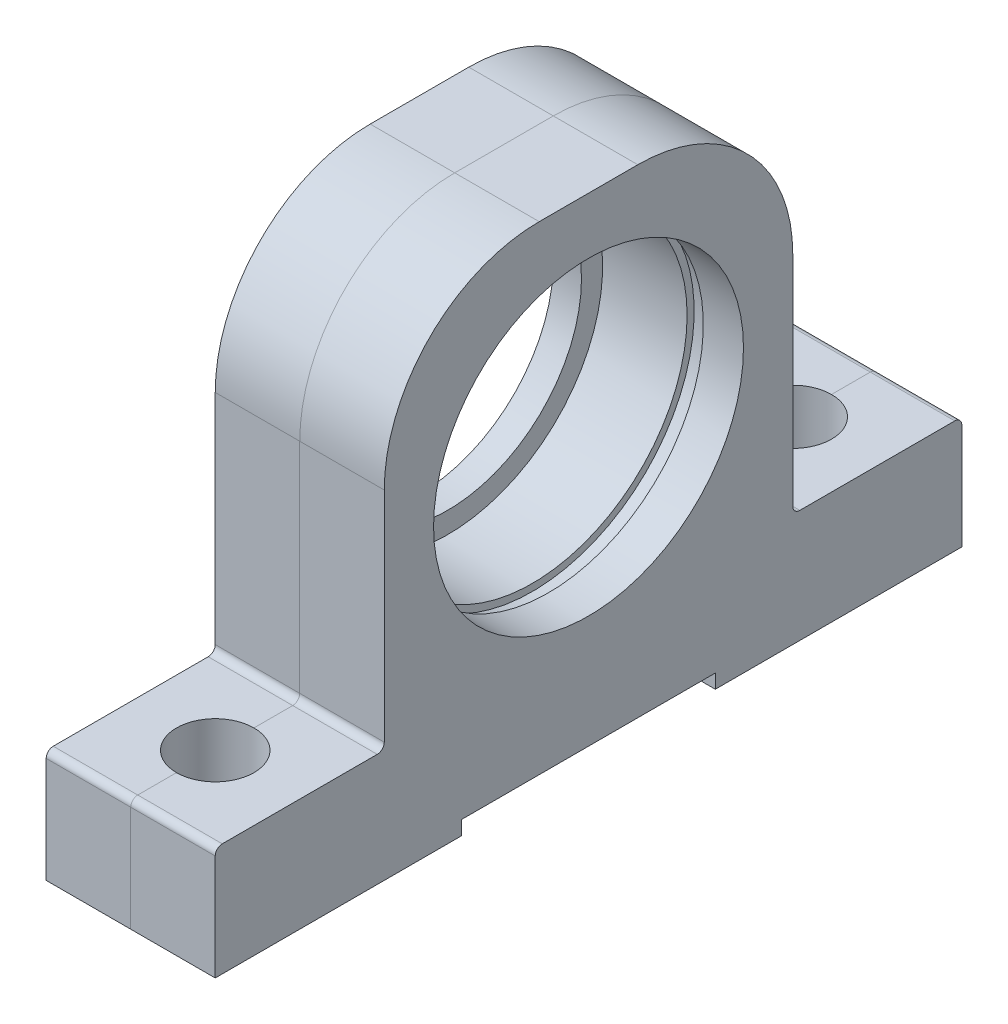
ISO-10303-21;
HEADER;
FILE_DESCRIPTION(('STEP AP214'),'2;1');
FILE_NAME('part.step','',(''),(''),'','','');
FILE_SCHEMA(('AUTOMOTIVE_DESIGN { 1 0 10303 214 1 1 1 1 }'));
ENDSEC;
DATA;
#1=APPLICATION_CONTEXT('core data for automotive mechanical design processes');
#2=APPLICATION_PROTOCOL_DEFINITION('international standard','automotive_design',2000,#1);
#3=PRODUCT_CONTEXT('',#1,'mechanical');
#4=PRODUCT('Part','Part','',(#3));
#5=PRODUCT_RELATED_PRODUCT_CATEGORY('part','',(#4));
#6=PRODUCT_DEFINITION_FORMATION('','',#4);
#7=PRODUCT_DEFINITION_CONTEXT('part definition',#1,'design');
#8=PRODUCT_DEFINITION('design','',#6,#7);
#9=PRODUCT_DEFINITION_SHAPE('','',#8);
#10=(LENGTH_UNIT() NAMED_UNIT(*) SI_UNIT(.MILLI.,.METRE.));
#11=(NAMED_UNIT(*) PLANE_ANGLE_UNIT() SI_UNIT($,.RADIAN.));
#12=(NAMED_UNIT(*) SI_UNIT($,.STERADIAN.) SOLID_ANGLE_UNIT());
#13=UNCERTAINTY_MEASURE_WITH_UNIT(LENGTH_MEASURE(1.E-05),#10,'distance_accuracy_value','');
#14=(GEOMETRIC_REPRESENTATION_CONTEXT(3) GLOBAL_UNCERTAINTY_ASSIGNED_CONTEXT((#13)) GLOBAL_UNIT_ASSIGNED_CONTEXT((#10,
#11,#12)) REPRESENTATION_CONTEXT('',''));
#15=CARTESIAN_POINT('',(0.,0.,0.));
#16=DIRECTION('',(0.,0.,1.));
#17=DIRECTION('',(1.,0.,0.));
#18=AXIS2_PLACEMENT_3D('',#15,#16,#17);
#19=CARTESIAN_POINT('',(6.,-11.5,14.5));
#20=DIRECTION('',(0.,0.,1.));
#21=DIRECTION('',(0.,1.,0.));
#22=AXIS2_PLACEMENT_3D('',#19,#20,#21);
#23=PLANE('',#22);
#24=DIRECTION('',(1.,0.,0.));
#25=VECTOR('',#24,1.);
#26=CARTESIAN_POINT('',(-6.,-11.5,14.5));
#27=LINE('',#26,#25);
#28=CARTESIAN_POINT('',(0.,-11.4999999999999,14.5));
#29=VERTEX_POINT('',#28);
#30=CARTESIAN_POINT('',(-6.,-11.5,14.5));
#31=VERTEX_POINT('',#30);
#32=EDGE_CURVE('E512',#29,#31,#27,.F.);
#33=ORIENTED_EDGE('',*,*,#32,.F.);
#34=DIRECTION('',(0.,1.,0.));
#35=VECTOR('',#34,1.);
#36=CARTESIAN_POINT('',(0.,-11.5,14.5));
#37=LINE('',#36,#35);
#38=CARTESIAN_POINT('',(0.,3.99999999999996,14.4999999999999));
#39=VERTEX_POINT('',#38);
#40=EDGE_CURVE('E12',#29,#39,#37,.T.);
#41=ORIENTED_EDGE('',*,*,#40,.T.);
#42=DIRECTION('',(1.,0.,0.));
#43=VECTOR('',#42,1.);
#44=CARTESIAN_POINT('',(-6.,3.99999999999996,14.4999999999999));
#45=LINE('',#44,#43);
#46=CARTESIAN_POINT('',(-6.,3.99999999999996,14.4999999999999));
#47=VERTEX_POINT('',#46);
#48=EDGE_CURVE('E493',#39,#47,#45,.F.);
#49=ORIENTED_EDGE('',*,*,#48,.T.);
#50=DIRECTION('',(0.,-1.,0.));
#51=VECTOR('',#50,1.);
#52=CARTESIAN_POINT('',(-6.,3.99999999999996,14.5));
#53=LINE('',#52,#51);
#54=EDGE_CURVE('E506',#47,#31,#53,.T.);
#55=ORIENTED_EDGE('',*,*,#54,.T.);
#56=EDGE_LOOP('',(#33,#41,#49,#55));
#57=FACE_BOUND('',#56,.T.);
#58=ADVANCED_FACE('F43',(#57),#23,.T.);
#59=CARTESIAN_POINT('',(6.,3.99999999999992,3.49999999999992));
#60=DIRECTION('',(-1.,0.,0.));
#61=DIRECTION('',(0.,0.,1.));
#62=AXIS2_PLACEMENT_3D('',#59,#60,#61);
#63=CYLINDRICAL_SURFACE('',#62,11.);
#64=ORIENTED_EDGE('',*,*,#48,.F.);
#65=CARTESIAN_POINT('',(0.,3.99999999999992,3.49999999999992));
#66=DIRECTION('',(-1.,0.,0.));
#67=DIRECTION('',(0.,0.,-1.));
#68=AXIS2_PLACEMENT_3D('',#65,#66,#67);
#69=CIRCLE('',#68,11.);
#70=CARTESIAN_POINT('',(0.,15.,3.5));
#71=VERTEX_POINT('',#70);
#72=EDGE_CURVE('E52',#39,#71,#69,.T.);
#73=ORIENTED_EDGE('',*,*,#72,.T.);
#74=DIRECTION('',(1.,0.,0.));
#75=VECTOR('',#74,1.);
#76=CARTESIAN_POINT('',(-6.,15.,3.5));
#77=LINE('',#76,#75);
#78=CARTESIAN_POINT('',(-6.,15.,3.5));
#79=VERTEX_POINT('',#78);
#80=EDGE_CURVE('E476',#71,#79,#77,.F.);
#81=ORIENTED_EDGE('',*,*,#80,.T.);
#82=CARTESIAN_POINT('',(-6.,3.99999999999992,3.49999999999992));
#83=DIRECTION('',(1.,0.,0.));
#84=DIRECTION('',(0.,1.,0.));
#85=AXIS2_PLACEMENT_3D('',#82,#83,#84);
#86=CIRCLE('',#85,11.);
#87=EDGE_CURVE('E497',#79,#47,#86,.T.);
#88=ORIENTED_EDGE('',*,*,#87,.T.);
#89=EDGE_LOOP('',(#64,#73,#81,#88));
#90=FACE_BOUND('',#89,.T.);
#91=ADVANCED_FACE('F828',(#90),#63,.T.);
#92=CARTESIAN_POINT('',(-6.,15.,3.5));
#93=DIRECTION('',(0.,1.,0.));
#94=DIRECTION('',(1.,0.,0.));
#95=AXIS2_PLACEMENT_3D('',#92,#93,#94);
#96=PLANE('',#95);
#97=ORIENTED_EDGE('',*,*,#80,.F.);
#98=DIRECTION('',(0.,0.,-1.));
#99=VECTOR('',#98,1.);
#100=CARTESIAN_POINT('',(0.,15.,3.5));
#101=LINE('',#100,#99);
#102=CARTESIAN_POINT('',(0.,14.9999999999999,-3.5));
#103=VERTEX_POINT('',#102);
#104=EDGE_CURVE('E490',#71,#103,#101,.T.);
#105=ORIENTED_EDGE('',*,*,#104,.T.);
#106=DIRECTION('',(1.,0.,0.));
#107=VECTOR('',#106,1.);
#108=CARTESIAN_POINT('',(-6.,14.9999999999999,-3.5));
#109=LINE('',#108,#107);
#110=CARTESIAN_POINT('',(-6.,14.9999999999999,-3.5));
#111=VERTEX_POINT('',#110);
#112=EDGE_CURVE('E455',#103,#111,#109,.F.);
#113=ORIENTED_EDGE('',*,*,#112,.T.);
#114=DIRECTION('',(0.,0.,1.));
#115=VECTOR('',#114,1.);
#116=CARTESIAN_POINT('',(-6.,15.,-3.5));
#117=LINE('',#116,#115);
#118=EDGE_CURVE('E470',#111,#79,#117,.T.);
#119=ORIENTED_EDGE('',*,*,#118,.T.);
#120=EDGE_LOOP('',(#97,#105,#113,#119));
#121=FACE_BOUND('',#120,.T.);
#122=ADVANCED_FACE('F830',(#121),#96,.T.);
#123=CARTESIAN_POINT('',(6.,3.99999999999992,-3.49999999999993));
#124=DIRECTION('',(-1.,0.,0.));
#125=DIRECTION('',(0.,1.,0.));
#126=AXIS2_PLACEMENT_3D('',#123,#124,#125);
#127=CYLINDRICAL_SURFACE('',#126,11.);
#128=ORIENTED_EDGE('',*,*,#112,.F.);
#129=CARTESIAN_POINT('',(0.,3.99999999999992,-3.49999999999993));
#130=DIRECTION('',(-1.,0.,0.));
#131=DIRECTION('',(0.,0.,-1.));
#132=AXIS2_PLACEMENT_3D('',#129,#130,#131);
#133=CIRCLE('',#132,11.);
#134=CARTESIAN_POINT('',(0.,3.99999999999998,-14.5));
#135=VERTEX_POINT('',#134);
#136=EDGE_CURVE('E454',#103,#135,#133,.T.);
#137=ORIENTED_EDGE('',*,*,#136,.T.);
#138=DIRECTION('',(1.,0.,0.));
#139=VECTOR('',#138,1.);
#140=CARTESIAN_POINT('',(-6.,3.99999999999998,-14.5));
#141=LINE('',#140,#139);
#142=CARTESIAN_POINT('',(-6.,3.99999999999998,-14.5));
#143=VERTEX_POINT('',#142);
#144=EDGE_CURVE('E433',#135,#143,#141,.F.);
#145=ORIENTED_EDGE('',*,*,#144,.T.);
#146=CARTESIAN_POINT('',(-6.,3.99999999999992,-3.49999999999993));
#147=DIRECTION('',(1.,0.,0.));
#148=DIRECTION('',(0.,0.,-1.));
#149=AXIS2_PLACEMENT_3D('',#146,#147,#148);
#150=CIRCLE('',#149,11.);
#151=EDGE_CURVE('E460',#143,#111,#150,.T.);
#152=ORIENTED_EDGE('',*,*,#151,.T.);
#153=EDGE_LOOP('',(#128,#137,#145,#152));
#154=FACE_BOUND('',#153,.T.);
#155=ADVANCED_FACE('F777',(#154),#127,.T.);
#156=CARTESIAN_POINT('',(-6.,-11.5,-14.5));
#157=DIRECTION('',(0.,0.,-1.));
#158=DIRECTION('',(0.,1.,0.));
#159=AXIS2_PLACEMENT_3D('',#156,#157,#158);
#160=PLANE('',#159);
#161=ORIENTED_EDGE('',*,*,#144,.F.);
#162=DIRECTION('',(0.,-1.,0.));
#163=VECTOR('',#162,1.);
#164=CARTESIAN_POINT('',(0.,-11.5,-14.5));
#165=LINE('',#164,#163);
#166=CARTESIAN_POINT('',(0.,-11.4999999999995,-14.5));
#167=VERTEX_POINT('',#166);
#168=EDGE_CURVE('E451',#135,#167,#165,.T.);
#169=ORIENTED_EDGE('',*,*,#168,.T.);
#170=DIRECTION('',(1.,0.,0.));
#171=VECTOR('',#170,1.);
#172=CARTESIAN_POINT('',(-6.,-11.4999999999995,-14.5));
#173=LINE('',#172,#171);
#174=CARTESIAN_POINT('',(-6.,-11.4999999999995,-14.5));
#175=VERTEX_POINT('',#174);
#176=EDGE_CURVE('E409',#167,#175,#173,.F.);
#177=ORIENTED_EDGE('',*,*,#176,.T.);
#178=DIRECTION('',(0.,1.,0.));
#179=VECTOR('',#178,1.);
#180=CARTESIAN_POINT('',(-6.,-11.4999999999995,-14.5));
#181=LINE('',#180,#179);
#182=EDGE_CURVE('E427',#175,#143,#181,.T.);
#183=ORIENTED_EDGE('',*,*,#182,.T.);
#184=EDGE_LOOP('',(#161,#169,#177,#183));
#185=FACE_BOUND('',#184,.T.);
#186=ADVANCED_FACE('F788',(#185),#160,.T.);
#187=CARTESIAN_POINT('',(-6.,-12.,-15.));
#188=DIRECTION('',(0.,1.,0.));
#189=DIRECTION('',(1.,0.,0.));
#190=AXIS2_PLACEMENT_3D('',#187,#188,#189);
#191=PLANE('',#190);
#192=CARTESIAN_POINT('',(0.,-12.,-20.5));
#193=DIRECTION('',(0.,-1.,0.));
#194=DIRECTION('',(0.,0.,1.));
#195=AXIS2_PLACEMENT_3D('',#192,#193,#194);
#196=CIRCLE('',#195,2.75);
#197=CARTESIAN_POINT('',(0.,-12.,-17.75));
#198=VERTEX_POINT('',#197);
#199=CARTESIAN_POINT('',(0.,-12.,-23.25));
#200=VERTEX_POINT('',#199);
#201=EDGE_CURVE('E726',#198,#200,#196,.T.);
#202=ORIENTED_EDGE('',*,*,#201,.T.);
#203=DIRECTION('',(0.,0.,-1.));
#204=VECTOR('',#203,1.);
#205=CARTESIAN_POINT('',(0.,-12.,-15.));
#206=LINE('',#205,#204);
#207=CARTESIAN_POINT('',(0.,-12.,-26.));
#208=VERTEX_POINT('',#207);
#209=EDGE_CURVE('E449',#200,#208,#206,.T.);
#210=ORIENTED_EDGE('',*,*,#209,.T.);
#211=DIRECTION('',(1.,0.,0.));
#212=VECTOR('',#211,1.);
#213=CARTESIAN_POINT('',(-6.,-12.,-26.));
#214=LINE('',#213,#212);
#215=CARTESIAN_POINT('',(-6.,-12.,-26.));
#216=VERTEX_POINT('',#215);
#217=EDGE_CURVE('E391',#208,#216,#214,.F.);
#218=ORIENTED_EDGE('',*,*,#217,.T.);
#219=DIRECTION('',(0.,0.,1.));
#220=VECTOR('',#219,1.);
#221=CARTESIAN_POINT('',(-6.,-12.,-26.));
#222=LINE('',#221,#220);
#223=CARTESIAN_POINT('',(-6.,-12.,-15.));
#224=VERTEX_POINT('',#223);
#225=EDGE_CURVE('E712',#216,#224,#222,.T.);
#226=ORIENTED_EDGE('',*,*,#225,.T.);
#227=DIRECTION('',(1.,0.,0.));
#228=VECTOR('',#227,1.);
#229=CARTESIAN_POINT('',(-6.,-12.,-15.));
#230=LINE('',#229,#228);
#231=CARTESIAN_POINT('',(0.,-12.,-15.));
#232=VERTEX_POINT('',#231);
#233=EDGE_CURVE('E415',#232,#224,#230,.F.);
#234=ORIENTED_EDGE('',*,*,#233,.F.);
#235=DIRECTION('',(0.,0.,-1.));
#236=VECTOR('',#235,1.);
#237=CARTESIAN_POINT('',(0.,-12.,-15.));
#238=LINE('',#237,#236);
#239=EDGE_CURVE('E768',#232,#198,#238,.T.);
#240=ORIENTED_EDGE('',*,*,#239,.T.);
#241=EDGE_LOOP('',(#202,#210,#218,#226,#234,#240));
#242=FACE_BOUND('',#241,.T.);
#243=ADVANCED_FACE('F839',(#242),#191,.T.);
#244=CARTESIAN_POINT('',(6.,-11.4999999999991,-15.000000000001));
#245=DIRECTION('',(-1.,0.,0.));
#246=DIRECTION('',(0.,-1.,1.9005181211384E-12));
#247=AXIS2_PLACEMENT_3D('',#244,#245,#246);
#248=CYLINDRICAL_SURFACE('',#247,0.500000000000934);
#249=CARTESIAN_POINT('',(6.,-12.,-15.));
#250=VERTEX_POINT('',#249);
#251=EDGE_CURVE('E717',#250,#232,#230,.F.);
#252=ORIENTED_EDGE('',*,*,#251,.T.);
#253=CARTESIAN_POINT('',(0.,-11.4999999999991,-15.000000000001));
#254=DIRECTION('',(-1.,0.,0.));
#255=DIRECTION('',(0.,0.,-1.));
#256=AXIS2_PLACEMENT_3D('',#253,#254,#255);
#257=CIRCLE('',#256,0.500000000000934);
#258=EDGE_CURVE('E408',#232,#167,#257,.T.);
#259=ORIENTED_EDGE('',*,*,#258,.T.);
#260=CARTESIAN_POINT('',(6.,-11.4999999999995,-14.5));
#261=VERTEX_POINT('',#260);
#262=EDGE_CURVE('E413',#261,#167,#173,.F.);
#263=ORIENTED_EDGE('',*,*,#262,.F.);
#264=CARTESIAN_POINT('',(6.,-11.4999999999991,-15.000000000001));
#265=DIRECTION('',(1.,0.,0.));
#266=DIRECTION('',(0.,-9.41469124880373E-13,1.));
#267=AXIS2_PLACEMENT_3D('',#264,#265,#266);
#268=CIRCLE('',#267,0.500000000000934);
#269=EDGE_CURVE('E422',#261,#250,#268,.T.);
#270=ORIENTED_EDGE('',*,*,#269,.T.);
#271=EDGE_LOOP('',(#252,#259,#263,#270));
#272=FACE_BOUND('',#271,.T.);
#273=ADVANCED_FACE('F843',(#272),#248,.F.);
#274=CARTESIAN_POINT('',(6.,-12.5000000000009,-25.9999999999991));
#275=DIRECTION('',(-1.,0.,0.));
#276=DIRECTION('',(0.,1.,-1.88998244478191E-12));
#277=AXIS2_PLACEMENT_3D('',#274,#275,#276);
#278=CYLINDRICAL_SURFACE('',#277,0.50000000000093);
#279=ORIENTED_EDGE('',*,*,#217,.F.);
#280=CARTESIAN_POINT('',(0.,-12.5000000000009,-25.9999999999991));
#281=DIRECTION('',(-1.,0.,0.));
#282=DIRECTION('',(0.,0.,-1.));
#283=AXIS2_PLACEMENT_3D('',#280,#281,#282);
#284=CIRCLE('',#283,0.50000000000093);
#285=CARTESIAN_POINT('',(0.,-12.5000000000001,-26.5));
#286=VERTEX_POINT('',#285);
#287=EDGE_CURVE('E405',#208,#286,#284,.T.);
#288=ORIENTED_EDGE('',*,*,#287,.T.);
#289=DIRECTION('',(1.,0.,0.));
#290=VECTOR('',#289,1.);
#291=CARTESIAN_POINT('',(-6.,-12.5,-26.5));
#292=LINE('',#291,#290);
#293=CARTESIAN_POINT('',(-6.,-12.5,-26.5));
#294=VERTEX_POINT('',#293);
#295=EDGE_CURVE('E370',#286,#294,#292,.F.);
#296=ORIENTED_EDGE('',*,*,#295,.T.);
#297=CARTESIAN_POINT('',(-6.,-12.5000000000009,-25.9999999999991));
#298=DIRECTION('',(1.,0.,0.));
#299=DIRECTION('',(0.,1.76214598468177E-12,-1.));
#300=AXIS2_PLACEMENT_3D('',#297,#298,#299);
#301=CIRCLE('',#300,0.50000000000093);
#302=EDGE_CURVE('E385',#294,#216,#301,.T.);
#303=ORIENTED_EDGE('',*,*,#302,.T.);
#304=EDGE_LOOP('',(#279,#288,#296,#303));
#305=FACE_BOUND('',#304,.T.);
#306=ADVANCED_FACE('F859',(#305),#278,.T.);
#307=CARTESIAN_POINT('',(-6.,-20.,-26.5));
#308=DIRECTION('',(0.,0.,-1.));
#309=DIRECTION('',(0.,1.,0.));
#310=AXIS2_PLACEMENT_3D('',#307,#308,#309);
#311=PLANE('',#310);
#312=ORIENTED_EDGE('',*,*,#295,.F.);
#313=DIRECTION('',(0.,-1.,0.));
#314=VECTOR('',#313,1.);
#315=CARTESIAN_POINT('',(0.,-20.,-26.5));
#316=LINE('',#315,#314);
#317=CARTESIAN_POINT('',(0.,-20.,-26.5));
#318=VERTEX_POINT('',#317);
#319=EDGE_CURVE('E369',#286,#318,#316,.T.);
#320=ORIENTED_EDGE('',*,*,#319,.T.);
#321=DIRECTION('',(1.,0.,0.));
#322=VECTOR('',#321,1.);
#323=CARTESIAN_POINT('',(-6.,-20.,-26.5));
#324=LINE('',#323,#322);
#325=CARTESIAN_POINT('',(-6.,-20.,-26.5));
#326=VERTEX_POINT('',#325);
#327=EDGE_CURVE('E690',#318,#326,#324,.F.);
#328=ORIENTED_EDGE('',*,*,#327,.T.);
#329=DIRECTION('',(0.,1.,0.));
#330=VECTOR('',#329,1.);
#331=CARTESIAN_POINT('',(-6.,-20.,-26.5));
#332=LINE('',#331,#330);
#333=EDGE_CURVE('E375',#326,#294,#332,.T.);
#334=ORIENTED_EDGE('',*,*,#333,.T.);
#335=EDGE_LOOP('',(#312,#320,#328,#334));
#336=FACE_BOUND('',#335,.T.);
#337=ADVANCED_FACE('F864',(#336),#311,.T.);
#338=CARTESIAN_POINT('',(-6.,-20.,-26.5));
#339=DIRECTION('',(0.,-1.,0.));
#340=DIRECTION('',(1.,0.,0.));
#341=AXIS2_PLACEMENT_3D('',#338,#339,#340);
#342=PLANE('',#341);
#343=CARTESIAN_POINT('',(0.,-20.,-20.5));
#344=DIRECTION('',(0.,1.,0.));
#345=DIRECTION('',(0.,0.,-1.));
#346=AXIS2_PLACEMENT_3D('',#343,#344,#345);
#347=CIRCLE('',#346,2.75);
#348=CARTESIAN_POINT('',(0.,-20.,-17.75));
#349=VERTEX_POINT('',#348);
#350=CARTESIAN_POINT('',(0.,-20.,-23.25));
#351=VERTEX_POINT('',#350);
#352=EDGE_CURVE('E699',#349,#351,#347,.F.);
#353=ORIENTED_EDGE('',*,*,#352,.F.);
#354=DIRECTION('',(0.,0.,1.));
#355=VECTOR('',#354,1.);
#356=CARTESIAN_POINT('',(0.,-20.,-26.5));
#357=LINE('',#356,#355);
#358=CARTESIAN_POINT('',(0.,-20.,-9.));
#359=VERTEX_POINT('',#358);
#360=EDGE_CURVE('E366',#349,#359,#357,.T.);
#361=ORIENTED_EDGE('',*,*,#360,.T.);
#362=DIRECTION('',(1.,0.,0.));
#363=VECTOR('',#362,1.);
#364=CARTESIAN_POINT('',(-6.,-20.,-9.));
#365=LINE('',#364,#363);
#366=CARTESIAN_POINT('',(-6.,-20.,-9.));
#367=VERTEX_POINT('',#366);
#368=EDGE_CURVE('E349',#359,#367,#365,.F.);
#369=ORIENTED_EDGE('',*,*,#368,.T.);
#370=DIRECTION('',(0.,0.,-1.));
#371=VECTOR('',#370,1.);
#372=CARTESIAN_POINT('',(-6.,-20.,-9.));
#373=LINE('',#372,#371);
#374=EDGE_CURVE('E687',#367,#326,#373,.T.);
#375=ORIENTED_EDGE('',*,*,#374,.T.);
#376=ORIENTED_EDGE('',*,*,#327,.F.);
#377=DIRECTION('',(0.,0.,1.));
#378=VECTOR('',#377,1.);
#379=CARTESIAN_POINT('',(0.,-20.,-26.5));
#380=LINE('',#379,#378);
#381=EDGE_CURVE('E365',#318,#351,#380,.T.);
#382=ORIENTED_EDGE('',*,*,#381,.T.);
#383=EDGE_LOOP('',(#353,#361,#369,#375,#376,#382));
#384=FACE_BOUND('',#383,.T.);
#385=ADVANCED_FACE('F869',(#384),#342,.T.);
#386=CARTESIAN_POINT('',(-6.,-19.,-9.));
#387=DIRECTION('',(0.,-1.,0.));
#388=DIRECTION('',(1.,0.,0.));
#389=AXIS2_PLACEMENT_3D('',#386,#387,#388);
#390=PLANE('',#389);
#391=DIRECTION('',(1.,0.,0.));
#392=VECTOR('',#391,1.);
#393=CARTESIAN_POINT('',(-6.,-19.,-9.));
#394=LINE('',#393,#392);
#395=CARTESIAN_POINT('',(0.,-19.,-9.));
#396=VERTEX_POINT('',#395);
#397=CARTESIAN_POINT('',(-6.,-19.,-9.));
#398=VERTEX_POINT('',#397);
#399=EDGE_CURVE('E328',#396,#398,#394,.F.);
#400=ORIENTED_EDGE('',*,*,#399,.F.);
#401=DIRECTION('',(0.,0.,1.));
#402=VECTOR('',#401,1.);
#403=CARTESIAN_POINT('',(0.,-19.,-9.));
#404=LINE('',#403,#402);
#405=CARTESIAN_POINT('',(0.,-19.,9.));
#406=VERTEX_POINT('',#405);
#407=EDGE_CURVE('E327',#396,#406,#404,.T.);
#408=ORIENTED_EDGE('',*,*,#407,.T.);
#409=DIRECTION('',(1.,0.,0.));
#410=VECTOR('',#409,1.);
#411=CARTESIAN_POINT('',(-6.,-19.,9.));
#412=LINE('',#411,#410);
#413=CARTESIAN_POINT('',(-6.,-19.,9.));
#414=VERTEX_POINT('',#413);
#415=EDGE_CURVE('E592',#406,#414,#412,.F.);
#416=ORIENTED_EDGE('',*,*,#415,.T.);
#417=DIRECTION('',(0.,0.,-1.));
#418=VECTOR('',#417,1.);
#419=CARTESIAN_POINT('',(-6.,-19.,9.));
#420=LINE('',#419,#418);
#421=EDGE_CURVE('E333',#414,#398,#420,.T.);
#422=ORIENTED_EDGE('',*,*,#421,.T.);
#423=EDGE_LOOP('',(#400,#408,#416,#422));
#424=FACE_BOUND('',#423,.T.);
#425=ADVANCED_FACE('F615',(#424),#390,.T.);
#426=CARTESIAN_POINT('',(-6.,-20.,9.));
#427=DIRECTION('',(0.,-1.,0.));
#428=DIRECTION('',(1.,0.,0.));
#429=AXIS2_PLACEMENT_3D('',#426,#427,#428);
#430=PLANE('',#429);
#431=CARTESIAN_POINT('',(0.,-20.,20.5));
#432=DIRECTION('',(0.,1.,0.));
#433=DIRECTION('',(0.,0.,-1.));
#434=AXIS2_PLACEMENT_3D('',#431,#432,#433);
#435=CIRCLE('',#434,2.75);
#436=CARTESIAN_POINT('',(0.,-20.,23.25));
#437=VERTEX_POINT('',#436);
#438=CARTESIAN_POINT('',(0.,-20.,17.75));
#439=VERTEX_POINT('',#438);
#440=EDGE_CURVE('E631',#437,#439,#435,.F.);
#441=ORIENTED_EDGE('',*,*,#440,.F.);
#442=DIRECTION('',(0.,0.,1.));
#443=VECTOR('',#442,1.);
#444=CARTESIAN_POINT('',(0.,-20.,9.));
#445=LINE('',#444,#443);
#446=CARTESIAN_POINT('',(0.,-20.,26.5));
#447=VERTEX_POINT('',#446);
#448=EDGE_CURVE('E324',#437,#447,#445,.T.);
#449=ORIENTED_EDGE('',*,*,#448,.T.);
#450=DIRECTION('',(1.,0.,0.));
#451=VECTOR('',#450,1.);
#452=CARTESIAN_POINT('',(-6.,-20.,26.5));
#453=LINE('',#452,#451);
#454=CARTESIAN_POINT('',(-6.,-20.,26.5));
#455=VERTEX_POINT('',#454);
#456=EDGE_CURVE('E271',#447,#455,#453,.F.);
#457=ORIENTED_EDGE('',*,*,#456,.T.);
#458=DIRECTION('',(0.,0.,-1.));
#459=VECTOR('',#458,1.);
#460=CARTESIAN_POINT('',(-6.,-20.,26.5));
#461=LINE('',#460,#459);
#462=CARTESIAN_POINT('',(-6.,-20.,9.));
#463=VERTEX_POINT('',#462);
#464=EDGE_CURVE('E269',#455,#463,#461,.T.);
#465=ORIENTED_EDGE('',*,*,#464,.T.);
#466=DIRECTION('',(1.,0.,0.));
#467=VECTOR('',#466,1.);
#468=CARTESIAN_POINT('',(-6.,-20.,9.));
#469=LINE('',#468,#467);
#470=CARTESIAN_POINT('',(0.,-20.,9.));
#471=VERTEX_POINT('',#470);
#472=EDGE_CURVE('E597',#471,#463,#469,.F.);
#473=ORIENTED_EDGE('',*,*,#472,.F.);
#474=DIRECTION('',(0.,0.,1.));
#475=VECTOR('',#474,1.);
#476=CARTESIAN_POINT('',(0.,-20.,9.));
#477=LINE('',#476,#475);
#478=EDGE_CURVE('E320',#471,#439,#477,.T.);
#479=ORIENTED_EDGE('',*,*,#478,.T.);
#480=EDGE_LOOP('',(#441,#449,#457,#465,#473,#479));
#481=FACE_BOUND('',#480,.T.);
#482=ADVANCED_FACE('F668',(#481),#430,.T.);
#483=CARTESIAN_POINT('',(6.,-20.,26.5));
#484=DIRECTION('',(0.,0.,1.));
#485=DIRECTION('',(0.,1.,0.));
#486=AXIS2_PLACEMENT_3D('',#483,#484,#485);
#487=PLANE('',#486);
#488=ORIENTED_EDGE('',*,*,#456,.F.);
#489=DIRECTION('',(0.,1.,0.));
#490=VECTOR('',#489,1.);
#491=CARTESIAN_POINT('',(0.,-20.,26.5));
#492=LINE('',#491,#490);
#493=CARTESIAN_POINT('',(0.,-12.5000000000005,26.5));
#494=VERTEX_POINT('',#493);
#495=EDGE_CURVE('E250',#447,#494,#492,.T.);
#496=ORIENTED_EDGE('',*,*,#495,.T.);
#497=DIRECTION('',(1.,0.,0.));
#498=VECTOR('',#497,1.);
#499=CARTESIAN_POINT('',(-6.,-12.5000000000005,26.5));
#500=LINE('',#499,#498);
#501=CARTESIAN_POINT('',(-6.,-12.5000000000005,26.5));
#502=VERTEX_POINT('',#501);
#503=EDGE_CURVE('E244',#494,#502,#500,.F.);
#504=ORIENTED_EDGE('',*,*,#503,.T.);
#505=DIRECTION('',(0.,-1.,0.));
#506=VECTOR('',#505,1.);
#507=CARTESIAN_POINT('',(-6.,-12.5000000000005,26.5));
#508=LINE('',#507,#506);
#509=EDGE_CURVE('E248',#502,#455,#508,.T.);
#510=ORIENTED_EDGE('',*,*,#509,.T.);
#511=EDGE_LOOP('',(#488,#496,#504,#510));
#512=FACE_BOUND('',#511,.T.);
#513=ADVANCED_FACE('F247',(#512),#487,.T.);
#514=CARTESIAN_POINT('',(-6.,-12.,26.));
#515=DIRECTION('',(0.,1.,0.));
#516=DIRECTION('',(1.,0.,0.));
#517=AXIS2_PLACEMENT_3D('',#514,#515,#516);
#518=PLANE('',#517);
#519=CARTESIAN_POINT('',(0.,-12.,20.5));
#520=DIRECTION('',(0.,-1.,0.));
#521=DIRECTION('',(0.,0.,1.));
#522=AXIS2_PLACEMENT_3D('',#519,#520,#521);
#523=CIRCLE('',#522,2.75);
#524=CARTESIAN_POINT('',(0.,-12.,23.25));
#525=VERTEX_POINT('',#524);
#526=CARTESIAN_POINT('',(0.,-12.,17.75));
#527=VERTEX_POINT('',#526);
#528=EDGE_CURVE('E556',#525,#527,#523,.T.);
#529=ORIENTED_EDGE('',*,*,#528,.T.);
#530=DIRECTION('',(0.,0.,-1.));
#531=VECTOR('',#530,1.);
#532=CARTESIAN_POINT('',(0.,-12.,26.));
#533=LINE('',#532,#531);
#534=CARTESIAN_POINT('',(0.,-12.,15.));
#535=VERTEX_POINT('',#534);
#536=EDGE_CURVE('E317',#527,#535,#533,.T.);
#537=ORIENTED_EDGE('',*,*,#536,.T.);
#538=DIRECTION('',(1.,0.,0.));
#539=VECTOR('',#538,1.);
#540=CARTESIAN_POINT('',(-6.,-12.,15.));
#541=LINE('',#540,#539);
#542=CARTESIAN_POINT('',(-6.,-12.,15.));
#543=VERTEX_POINT('',#542);
#544=EDGE_CURVE('E526',#535,#543,#541,.F.);
#545=ORIENTED_EDGE('',*,*,#544,.T.);
#546=DIRECTION('',(0.,0.,1.));
#547=VECTOR('',#546,1.);
#548=CARTESIAN_POINT('',(-6.,-12.,15.));
#549=LINE('',#548,#547);
#550=CARTESIAN_POINT('',(-6.,-12.,26.));
#551=VERTEX_POINT('',#550);
#552=EDGE_CURVE('E543',#543,#551,#549,.T.);
#553=ORIENTED_EDGE('',*,*,#552,.T.);
#554=DIRECTION('',(-1.,0.,0.));
#555=VECTOR('',#554,1.);
#556=CARTESIAN_POINT('',(6.,-12.,26.));
#557=LINE('',#556,#555);
#558=CARTESIAN_POINT('',(0.,-12.,26.));
#559=VERTEX_POINT('',#558);
#560=EDGE_CURVE('E276',#559,#551,#557,.T.);
#561=ORIENTED_EDGE('',*,*,#560,.F.);
#562=DIRECTION('',(0.,0.,-1.));
#563=VECTOR('',#562,1.);
#564=CARTESIAN_POINT('',(0.,-12.,26.));
#565=LINE('',#564,#563);
#566=EDGE_CURVE('E758',#559,#525,#565,.T.);
#567=ORIENTED_EDGE('',*,*,#566,.T.);
#568=EDGE_LOOP('',(#529,#537,#545,#553,#561,#567));
#569=FACE_BOUND('',#568,.T.);
#570=ADVANCED_FACE('F820',(#569),#518,.T.);
#571=CARTESIAN_POINT('',(6.,-12.5000000000009,25.9999999999991));
#572=DIRECTION('',(-1.,0.,0.));
#573=DIRECTION('',(0.,0.,1.));
#574=AXIS2_PLACEMENT_3D('',#571,#572,#573);
#575=CYLINDRICAL_SURFACE('',#574,0.50000000000093);
#576=ORIENTED_EDGE('',*,*,#503,.F.);
#577=CARTESIAN_POINT('',(0.,-12.5000000000009,25.9999999999991));
#578=DIRECTION('',(-1.,0.,0.));
#579=DIRECTION('',(0.,0.,-1.));
#580=AXIS2_PLACEMENT_3D('',#577,#578,#579);
#581=CIRCLE('',#580,0.50000000000093);
#582=EDGE_CURVE('E296',#494,#559,#581,.T.);
#583=ORIENTED_EDGE('',*,*,#582,.T.);
#584=ORIENTED_EDGE('',*,*,#560,.T.);
#585=CARTESIAN_POINT('',(-6.,-12.5000000000009,25.9999999999991));
#586=DIRECTION('',(1.,0.,0.));
#587=DIRECTION('',(0.,1.,1.89714910447594E-12));
#588=AXIS2_PLACEMENT_3D('',#585,#586,#587);
#589=CIRCLE('',#588,0.50000000000093);
#590=EDGE_CURVE('E258',#551,#502,#589,.T.);
#591=ORIENTED_EDGE('',*,*,#590,.T.);
#592=EDGE_LOOP('',(#576,#583,#584,#591));
#593=FACE_BOUND('',#592,.T.);
#594=ADVANCED_FACE('F274',(#593),#575,.T.);
#595=CARTESIAN_POINT('',(6.,-11.4999999999991,15.000000000001));
#596=DIRECTION('',(-1.,0.,0.));
#597=DIRECTION('',(0.,0.,-1.));
#598=AXIS2_PLACEMENT_3D('',#595,#596,#597);
#599=CYLINDRICAL_SURFACE('',#598,0.500000000000936);
#600=CARTESIAN_POINT('',(6.,-11.4999999999998,14.5));
#601=VERTEX_POINT('',#600);
#602=EDGE_CURVE('E515',#601,#29,#27,.F.);
#603=ORIENTED_EDGE('',*,*,#602,.T.);
#604=CARTESIAN_POINT('',(0.,-11.4999999999991,15.000000000001));
#605=DIRECTION('',(-1.,0.,0.));
#606=DIRECTION('',(0.,0.,-1.));
#607=AXIS2_PLACEMENT_3D('',#604,#605,#606);
#608=CIRCLE('',#607,0.500000000000936);
#609=EDGE_CURVE('E291',#29,#535,#608,.T.);
#610=ORIENTED_EDGE('',*,*,#609,.T.);
#611=CARTESIAN_POINT('',(6.,-12.,15.));
#612=VERTEX_POINT('',#611);
#613=EDGE_CURVE('E530',#612,#535,#541,.F.);
#614=ORIENTED_EDGE('',*,*,#613,.F.);
#615=CARTESIAN_POINT('',(6.,-11.4999999999991,15.000000000001));
#616=DIRECTION('',(1.,0.,0.));
#617=DIRECTION('',(0.,-1.,-1.90070181815471E-12));
#618=AXIS2_PLACEMENT_3D('',#615,#616,#617);
#619=CIRCLE('',#618,0.500000000000936);
#620=EDGE_CURVE('E538',#612,#601,#619,.T.);
#621=ORIENTED_EDGE('',*,*,#620,.T.);
#622=EDGE_LOOP('',(#603,#610,#614,#621));
#623=FACE_BOUND('',#622,.T.);
#624=ADVANCED_FACE('F807',(#623),#599,.F.);
#625=CARTESIAN_POINT('',(-6.,-20.,9.));
#626=DIRECTION('',(0.,0.,-1.));
#627=DIRECTION('',(0.,1.,0.));
#628=AXIS2_PLACEMENT_3D('',#625,#626,#627);
#629=PLANE('',#628);
#630=ORIENTED_EDGE('',*,*,#415,.F.);
#631=DIRECTION('',(0.,-1.,0.));
#632=VECTOR('',#631,1.);
#633=CARTESIAN_POINT('',(0.,-20.,9.));
#634=LINE('',#633,#632);
#635=EDGE_CURVE('E532',#406,#471,#634,.T.);
#636=ORIENTED_EDGE('',*,*,#635,.T.);
#637=ORIENTED_EDGE('',*,*,#472,.T.);
#638=DIRECTION('',(0.,1.,0.));
#639=VECTOR('',#638,1.);
#640=CARTESIAN_POINT('',(-6.,-20.,9.));
#641=LINE('',#640,#639);
#642=EDGE_CURVE('E596',#463,#414,#641,.T.);
#643=ORIENTED_EDGE('',*,*,#642,.T.);
#644=EDGE_LOOP('',(#630,#636,#637,#643));
#645=FACE_BOUND('',#644,.T.);
#646=ADVANCED_FACE('F622',(#645),#629,.T.);
#647=ORIENTED_EDGE('',*,*,#582,.F.);
#648=CARTESIAN_POINT('',(6.,-12.5000000000005,26.5));
#649=VERTEX_POINT('',#648);
#650=EDGE_CURVE('E257',#649,#494,#500,.F.);
#651=ORIENTED_EDGE('',*,*,#650,.F.);
#652=CARTESIAN_POINT('',(6.,-12.5000000000009,25.9999999999991));
#653=DIRECTION('',(-1.,0.,0.));
#654=DIRECTION('',(0.,9.20152842807617E-13,1.));
#655=AXIS2_PLACEMENT_3D('',#652,#653,#654);
#656=CIRCLE('',#655,0.50000000000093);
#657=CARTESIAN_POINT('',(6.,-12.,26.));
#658=VERTEX_POINT('',#657);
#659=EDGE_CURVE('E284',#658,#649,#656,.F.);
#660=ORIENTED_EDGE('',*,*,#659,.F.);
#661=EDGE_CURVE('E272',#658,#559,#557,.T.);
#662=ORIENTED_EDGE('',*,*,#661,.T.);
#663=EDGE_LOOP('',(#647,#651,#660,#662));
#664=FACE_BOUND('',#663,.T.);
#665=ADVANCED_FACE('F818',(#664),#575,.T.);
#666=ORIENTED_EDGE('',*,*,#495,.F.);
#667=CARTESIAN_POINT('',(6.,-20.,26.5));
#668=VERTEX_POINT('',#667);
#669=EDGE_CURVE('E304',#668,#447,#453,.F.);
#670=ORIENTED_EDGE('',*,*,#669,.F.);
#671=DIRECTION('',(0.,1.,0.));
#672=VECTOR('',#671,1.);
#673=CARTESIAN_POINT('',(6.,-20.,26.5));
#674=LINE('',#673,#672);
#675=EDGE_CURVE('E308',#649,#668,#674,.F.);
#676=ORIENTED_EDGE('',*,*,#675,.F.);
#677=ORIENTED_EDGE('',*,*,#650,.T.);
#678=EDGE_LOOP('',(#666,#670,#676,#677));
#679=FACE_BOUND('',#678,.T.);
#680=ADVANCED_FACE('F666',(#679),#487,.T.);
#681=ORIENTED_EDGE('',*,*,#448,.F.);
#682=EDGE_CURVE('E627',#439,#437,#435,.F.);
#683=ORIENTED_EDGE('',*,*,#682,.F.);
#684=ORIENTED_EDGE('',*,*,#478,.F.);
#685=CARTESIAN_POINT('',(6.,-20.,9.));
#686=VERTEX_POINT('',#685);
#687=EDGE_CURVE('E639',#686,#471,#469,.F.);
#688=ORIENTED_EDGE('',*,*,#687,.F.);
#689=DIRECTION('',(0.,0.,1.));
#690=VECTOR('',#689,1.);
#691=CARTESIAN_POINT('',(6.,-20.,9.));
#692=LINE('',#691,#690);
#693=EDGE_CURVE('E637',#668,#686,#692,.F.);
#694=ORIENTED_EDGE('',*,*,#693,.F.);
#695=ORIENTED_EDGE('',*,*,#669,.T.);
#696=EDGE_LOOP('',(#681,#683,#684,#688,#694,#695));
#697=FACE_BOUND('',#696,.T.);
#698=ADVANCED_FACE('F665',(#697),#430,.T.);
#699=ORIENTED_EDGE('',*,*,#635,.F.);
#700=CARTESIAN_POINT('',(6.,-19.,9.));
#701=VERTEX_POINT('',#700);
#702=EDGE_CURVE('E595',#701,#406,#412,.F.);
#703=ORIENTED_EDGE('',*,*,#702,.F.);
#704=DIRECTION('',(0.,-1.,0.));
#705=VECTOR('',#704,1.);
#706=CARTESIAN_POINT('',(6.,-19.,9.));
#707=LINE('',#706,#705);
#708=EDGE_CURVE('E603',#686,#701,#707,.F.);
#709=ORIENTED_EDGE('',*,*,#708,.F.);
#710=ORIENTED_EDGE('',*,*,#687,.T.);
#711=EDGE_LOOP('',(#699,#703,#709,#710));
#712=FACE_BOUND('',#711,.T.);
#713=ADVANCED_FACE('F676',(#712),#629,.T.);
#714=ORIENTED_EDGE('',*,*,#407,.F.);
#715=CARTESIAN_POINT('',(6.,-19.,-9.));
#716=VERTEX_POINT('',#715);
#717=EDGE_CURVE('E332',#716,#396,#394,.F.);
#718=ORIENTED_EDGE('',*,*,#717,.F.);
#719=DIRECTION('',(0.,0.,1.));
#720=VECTOR('',#719,1.);
#721=CARTESIAN_POINT('',(6.,-19.,-9.));
#722=LINE('',#721,#720);
#723=EDGE_CURVE('E339',#701,#716,#722,.F.);
#724=ORIENTED_EDGE('',*,*,#723,.F.);
#725=ORIENTED_EDGE('',*,*,#702,.T.);
#726=EDGE_LOOP('',(#714,#718,#724,#725));
#727=FACE_BOUND('',#726,.T.);
#728=ADVANCED_FACE('F682',(#727),#390,.T.);
#729=CARTESIAN_POINT('',(6.,-20.,-9.));
#730=DIRECTION('',(0.,0.,1.));
#731=DIRECTION('',(0.,1.,0.));
#732=AXIS2_PLACEMENT_3D('',#729,#730,#731);
#733=PLANE('',#732);
#734=DIRECTION('',(0.,-1.,0.));
#735=VECTOR('',#734,1.);
#736=CARTESIAN_POINT('',(-6.,-19.,-9.));
#737=LINE('',#736,#735);
#738=EDGE_CURVE('E343',#398,#367,#737,.T.);
#739=ORIENTED_EDGE('',*,*,#738,.T.);
#740=ORIENTED_EDGE('',*,*,#368,.F.);
#741=CARTESIAN_POINT('',(6.,-20.,-9.));
#742=VERTEX_POINT('',#741);
#743=EDGE_CURVE('E352',#742,#359,#365,.F.);
#744=ORIENTED_EDGE('',*,*,#743,.F.);
#745=DIRECTION('',(0.,1.,0.));
#746=VECTOR('',#745,1.);
#747=CARTESIAN_POINT('',(6.,-20.,-9.));
#748=LINE('',#747,#746);
#749=EDGE_CURVE('E356',#716,#742,#748,.F.);
#750=ORIENTED_EDGE('',*,*,#749,.F.);
#751=ORIENTED_EDGE('',*,*,#717,.T.);
#752=ORIENTED_EDGE('',*,*,#399,.T.);
#753=EDGE_LOOP('',(#739,#740,#744,#750,#751,#752));
#754=FACE_BOUND('',#753,.T.);
#755=ADVANCED_FACE('F881',(#754),#733,.T.);
#756=ORIENTED_EDGE('',*,*,#360,.F.);
#757=EDGE_CURVE('E702',#351,#349,#347,.F.);
#758=ORIENTED_EDGE('',*,*,#757,.F.);
#759=ORIENTED_EDGE('',*,*,#381,.F.);
#760=CARTESIAN_POINT('',(6.,-20.,-26.5));
#761=VERTEX_POINT('',#760);
#762=EDGE_CURVE('E693',#761,#318,#324,.F.);
#763=ORIENTED_EDGE('',*,*,#762,.F.);
#764=DIRECTION('',(0.,0.,1.));
#765=VECTOR('',#764,1.);
#766=CARTESIAN_POINT('',(6.,-20.,-26.5));
#767=LINE('',#766,#765);
#768=EDGE_CURVE('E696',#742,#761,#767,.F.);
#769=ORIENTED_EDGE('',*,*,#768,.F.);
#770=ORIENTED_EDGE('',*,*,#743,.T.);
#771=EDGE_LOOP('',(#756,#758,#759,#763,#769,#770));
#772=FACE_BOUND('',#771,.T.);
#773=ADVANCED_FACE('F877',(#772),#342,.T.);
#774=ORIENTED_EDGE('',*,*,#319,.F.);
#775=CARTESIAN_POINT('',(6.,-12.5000000000002,-26.5));
#776=VERTEX_POINT('',#775);
#777=EDGE_CURVE('E374',#776,#286,#292,.F.);
#778=ORIENTED_EDGE('',*,*,#777,.F.);
#779=DIRECTION('',(0.,-1.,0.));
#780=VECTOR('',#779,1.);
#781=CARTESIAN_POINT('',(6.,-12.5000000000002,-26.5));
#782=LINE('',#781,#780);
#783=EDGE_CURVE('E381',#761,#776,#782,.F.);
#784=ORIENTED_EDGE('',*,*,#783,.F.);
#785=ORIENTED_EDGE('',*,*,#762,.T.);
#786=EDGE_LOOP('',(#774,#778,#784,#785));
#787=FACE_BOUND('',#786,.T.);
#788=ADVANCED_FACE('F874',(#787),#311,.T.);
#789=ORIENTED_EDGE('',*,*,#287,.F.);
#790=CARTESIAN_POINT('',(6.,-12.,-26.));
#791=VERTEX_POINT('',#790);
#792=EDGE_CURVE('E394',#791,#208,#214,.F.);
#793=ORIENTED_EDGE('',*,*,#792,.F.);
#794=CARTESIAN_POINT('',(6.,-12.5000000000009,-25.9999999999991));
#795=DIRECTION('',(-1.,0.,0.));
#796=DIRECTION('',(0.,1.,-1.89714910447594E-12));
#797=AXIS2_PLACEMENT_3D('',#794,#795,#796);
#798=CIRCLE('',#797,0.50000000000093);
#799=EDGE_CURVE('E398',#776,#791,#798,.F.);
#800=ORIENTED_EDGE('',*,*,#799,.F.);
#801=ORIENTED_EDGE('',*,*,#777,.T.);
#802=EDGE_LOOP('',(#789,#793,#800,#801));
#803=FACE_BOUND('',#802,.T.);
#804=ADVANCED_FACE('F854',(#803),#278,.T.);
#805=ORIENTED_EDGE('',*,*,#209,.F.);
#806=EDGE_CURVE('E723',#200,#198,#196,.T.);
#807=ORIENTED_EDGE('',*,*,#806,.T.);
#808=ORIENTED_EDGE('',*,*,#239,.F.);
#809=ORIENTED_EDGE('',*,*,#251,.F.);
#810=DIRECTION('',(0.,0.,-1.));
#811=VECTOR('',#810,1.);
#812=CARTESIAN_POINT('',(6.,-12.,-15.));
#813=LINE('',#812,#811);
#814=EDGE_CURVE('E720',#791,#250,#813,.F.);
#815=ORIENTED_EDGE('',*,*,#814,.F.);
#816=ORIENTED_EDGE('',*,*,#792,.T.);
#817=EDGE_LOOP('',(#805,#807,#808,#809,#815,#816));
#818=FACE_BOUND('',#817,.T.);
#819=ADVANCED_FACE('F846',(#818),#191,.T.);
#820=ORIENTED_EDGE('',*,*,#258,.F.);
#821=ORIENTED_EDGE('',*,*,#233,.T.);
#822=CARTESIAN_POINT('',(-6.,-11.4999999999991,-15.000000000001));
#823=DIRECTION('',(-1.,0.,0.));
#824=DIRECTION('',(0.,-1.,1.90070181815472E-12));
#825=AXIS2_PLACEMENT_3D('',#822,#823,#824);
#826=CIRCLE('',#825,0.500000000000934);
#827=EDGE_CURVE('E414',#175,#224,#826,.F.);
#828=ORIENTED_EDGE('',*,*,#827,.F.);
#829=ORIENTED_EDGE('',*,*,#176,.F.);
#830=EDGE_LOOP('',(#820,#821,#828,#829));
#831=FACE_BOUND('',#830,.T.);
#832=ADVANCED_FACE('F836',(#831),#248,.F.);
#833=ORIENTED_EDGE('',*,*,#168,.F.);
#834=CARTESIAN_POINT('',(6.,3.99999999999998,-14.5));
#835=VERTEX_POINT('',#834);
#836=EDGE_CURVE('E436',#835,#135,#141,.F.);
#837=ORIENTED_EDGE('',*,*,#836,.F.);
#838=DIRECTION('',(0.,-1.,0.));
#839=VECTOR('',#838,1.);
#840=CARTESIAN_POINT('',(6.,3.99999999999998,-14.5));
#841=LINE('',#840,#839);
#842=EDGE_CURVE('E440',#261,#835,#841,.F.);
#843=ORIENTED_EDGE('',*,*,#842,.F.);
#844=ORIENTED_EDGE('',*,*,#262,.T.);
#845=EDGE_LOOP('',(#833,#837,#843,#844));
#846=FACE_BOUND('',#845,.T.);
#847=ADVANCED_FACE('F784',(#846),#160,.T.);
#848=ORIENTED_EDGE('',*,*,#136,.F.);
#849=CARTESIAN_POINT('',(6.,14.9999999999999,-3.5));
#850=VERTEX_POINT('',#849);
#851=EDGE_CURVE('E459',#850,#103,#109,.F.);
#852=ORIENTED_EDGE('',*,*,#851,.F.);
#853=CARTESIAN_POINT('',(6.,3.99999999999992,-3.49999999999993));
#854=DIRECTION('',(-1.,0.,0.));
#855=DIRECTION('',(0.,1.,0.));
#856=AXIS2_PLACEMENT_3D('',#853,#854,#855);
#857=CIRCLE('',#856,11.);
#858=EDGE_CURVE('E466',#835,#850,#857,.F.);
#859=ORIENTED_EDGE('',*,*,#858,.F.);
#860=ORIENTED_EDGE('',*,*,#836,.T.);
#861=EDGE_LOOP('',(#848,#852,#859,#860));
#862=FACE_BOUND('',#861,.T.);
#863=ADVANCED_FACE('F791',(#862),#127,.T.);
#864=ORIENTED_EDGE('',*,*,#104,.F.);
#865=CARTESIAN_POINT('',(6.,15.,3.5));
#866=VERTEX_POINT('',#865);
#867=EDGE_CURVE('E479',#866,#71,#77,.F.);
#868=ORIENTED_EDGE('',*,*,#867,.F.);
#869=DIRECTION('',(0.,0.,-1.));
#870=VECTOR('',#869,1.);
#871=CARTESIAN_POINT('',(6.,15.,3.5));
#872=LINE('',#871,#870);
#873=EDGE_CURVE('E483',#850,#866,#872,.F.);
#874=ORIENTED_EDGE('',*,*,#873,.F.);
#875=ORIENTED_EDGE('',*,*,#851,.T.);
#876=EDGE_LOOP('',(#864,#868,#874,#875));
#877=FACE_BOUND('',#876,.T.);
#878=ADVANCED_FACE('F796',(#877),#96,.T.);
#879=ORIENTED_EDGE('',*,*,#72,.F.);
#880=CARTESIAN_POINT('',(6.,3.99999999999996,14.4999999999999));
#881=VERTEX_POINT('',#880);
#882=EDGE_CURVE('E496',#881,#39,#45,.F.);
#883=ORIENTED_EDGE('',*,*,#882,.F.);
#884=CARTESIAN_POINT('',(6.,3.99999999999992,3.49999999999992));
#885=DIRECTION('',(-1.,0.,0.));
#886=DIRECTION('',(0.,0.,1.));
#887=AXIS2_PLACEMENT_3D('',#884,#885,#886);
#888=CIRCLE('',#887,11.);
#889=EDGE_CURVE('E502',#866,#881,#888,.F.);
#890=ORIENTED_EDGE('',*,*,#889,.F.);
#891=ORIENTED_EDGE('',*,*,#867,.T.);
#892=EDGE_LOOP('',(#879,#883,#890,#891));
#893=FACE_BOUND('',#892,.T.);
#894=ADVANCED_FACE('F799',(#893),#63,.T.);
#895=ORIENTED_EDGE('',*,*,#40,.F.);
#896=ORIENTED_EDGE('',*,*,#602,.F.);
#897=DIRECTION('',(0.,1.,0.));
#898=VECTOR('',#897,1.);
#899=CARTESIAN_POINT('',(6.,-11.4999999999998,14.5));
#900=LINE('',#899,#898);
#901=EDGE_CURVE('E519',#881,#601,#900,.F.);
#902=ORIENTED_EDGE('',*,*,#901,.F.);
#903=ORIENTED_EDGE('',*,*,#882,.T.);
#904=EDGE_LOOP('',(#895,#896,#902,#903));
#905=FACE_BOUND('',#904,.T.);
#906=ADVANCED_FACE('F804',(#905),#23,.T.);
#907=ORIENTED_EDGE('',*,*,#609,.F.);
#908=ORIENTED_EDGE('',*,*,#32,.T.);
#909=CARTESIAN_POINT('',(-6.,-11.4999999999991,15.000000000001));
#910=DIRECTION('',(-1.,0.,0.));
#911=DIRECTION('',(0.,-1.81543668986366E-12,-1.));
#912=AXIS2_PLACEMENT_3D('',#909,#910,#911);
#913=CIRCLE('',#912,0.500000000000936);
#914=EDGE_CURVE('E531',#543,#31,#913,.F.);
#915=ORIENTED_EDGE('',*,*,#914,.F.);
#916=ORIENTED_EDGE('',*,*,#544,.F.);
#917=EDGE_LOOP('',(#907,#908,#915,#916));
#918=FACE_BOUND('',#917,.T.);
#919=ADVANCED_FACE('F825',(#918),#599,.F.);
#920=ORIENTED_EDGE('',*,*,#536,.F.);
#921=EDGE_CURVE('E553',#527,#525,#523,.T.);
#922=ORIENTED_EDGE('',*,*,#921,.T.);
#923=ORIENTED_EDGE('',*,*,#566,.F.);
#924=ORIENTED_EDGE('',*,*,#661,.F.);
#925=DIRECTION('',(0.,0.,-1.));
#926=VECTOR('',#925,1.);
#927=CARTESIAN_POINT('',(6.,-12.,26.));
#928=LINE('',#927,#926);
#929=EDGE_CURVE('E548',#612,#658,#928,.F.);
#930=ORIENTED_EDGE('',*,*,#929,.F.);
#931=ORIENTED_EDGE('',*,*,#613,.T.);
#932=EDGE_LOOP('',(#920,#922,#923,#924,#930,#931));
#933=FACE_BOUND('',#932,.T.);
#934=ADVANCED_FACE('F813',(#933),#518,.T.);
#935=CARTESIAN_POINT('',(6.,-20.,26.5));
#936=DIRECTION('',(1.,0.,0.));
#937=DIRECTION('',(0.,0.,-1.));
#938=AXIS2_PLACEMENT_3D('',#935,#936,#937);
#939=PLANE('',#938);
#940=ORIENTED_EDGE('',*,*,#659,.T.);
#941=ORIENTED_EDGE('',*,*,#675,.T.);
#942=ORIENTED_EDGE('',*,*,#693,.T.);
#943=ORIENTED_EDGE('',*,*,#708,.T.);
#944=ORIENTED_EDGE('',*,*,#723,.T.);
#945=ORIENTED_EDGE('',*,*,#749,.T.);
#946=ORIENTED_EDGE('',*,*,#768,.T.);
#947=ORIENTED_EDGE('',*,*,#783,.T.);
#948=ORIENTED_EDGE('',*,*,#799,.T.);
#949=ORIENTED_EDGE('',*,*,#814,.T.);
#950=ORIENTED_EDGE('',*,*,#269,.F.);
#951=ORIENTED_EDGE('',*,*,#842,.T.);
#952=ORIENTED_EDGE('',*,*,#858,.T.);
#953=ORIENTED_EDGE('',*,*,#873,.T.);
#954=ORIENTED_EDGE('',*,*,#889,.T.);
#955=ORIENTED_EDGE('',*,*,#901,.T.);
#956=ORIENTED_EDGE('',*,*,#620,.F.);
#957=ORIENTED_EDGE('',*,*,#929,.T.);
#958=EDGE_LOOP('',(#940,#941,#942,#943,#944,#945,#946,#947,#948,#949,#950,#951,#952,#953,#954,
#955,#956,#957));
#959=FACE_BOUND('',#958,.T.);
#960=CARTESIAN_POINT('',(6.,0.,0.));
#961=DIRECTION('',(-1.,0.,0.));
#962=DIRECTION('',(0.,0.,-1.));
#963=AXIS2_PLACEMENT_3D('',#960,#961,#962);
#964=CIRCLE('',#963,11.);
#965=CARTESIAN_POINT('',(6.,0.,-11.));
#966=VERTEX_POINT('',#965);
#967=EDGE_CURVE('E560',#966,#966,#964,.F.);
#968=ORIENTED_EDGE('',*,*,#967,.F.);
#969=EDGE_LOOP('',(#968));
#970=FACE_BOUND('',#969,.T.);
#971=ADVANCED_FACE('F656',(#959,#970),#939,.T.);
#972=CARTESIAN_POINT('',(-6.,-20.,26.5));
#973=DIRECTION('',(-1.,0.,0.));
#974=DIRECTION('',(0.,1.,0.));
#975=AXIS2_PLACEMENT_3D('',#972,#973,#974);
#976=PLANE('',#975);
#977=ORIENTED_EDGE('',*,*,#590,.F.);
#978=ORIENTED_EDGE('',*,*,#552,.F.);
#979=ORIENTED_EDGE('',*,*,#914,.T.);
#980=ORIENTED_EDGE('',*,*,#54,.F.);
#981=ORIENTED_EDGE('',*,*,#87,.F.);
#982=ORIENTED_EDGE('',*,*,#118,.F.);
#983=ORIENTED_EDGE('',*,*,#151,.F.);
#984=ORIENTED_EDGE('',*,*,#182,.F.);
#985=ORIENTED_EDGE('',*,*,#827,.T.);
#986=ORIENTED_EDGE('',*,*,#225,.F.);
#987=ORIENTED_EDGE('',*,*,#302,.F.);
#988=ORIENTED_EDGE('',*,*,#333,.F.);
#989=ORIENTED_EDGE('',*,*,#374,.F.);
#990=ORIENTED_EDGE('',*,*,#738,.F.);
#991=ORIENTED_EDGE('',*,*,#421,.F.);
#992=ORIENTED_EDGE('',*,*,#642,.F.);
#993=ORIENTED_EDGE('',*,*,#464,.F.);
#994=ORIENTED_EDGE('',*,*,#509,.F.);
#995=EDGE_LOOP('',(#977,#978,#979,#980,#981,#982,#983,#984,#985,#986,#987,#988,#989,#990,#991,
#992,#993,#994));
#996=FACE_BOUND('',#995,.T.);
#997=CARTESIAN_POINT('',(-6.,0.,0.));
#998=DIRECTION('',(1.,0.,0.));
#999=DIRECTION('',(0.,0.,1.));
#1000=AXIS2_PLACEMENT_3D('',#997,#998,#999);
#1001=CIRCLE('',#1000,9.5);
#1002=CARTESIAN_POINT('',(-6.,0.,9.5));
#1003=VERTEX_POINT('',#1002);
#1004=EDGE_CURVE('E564',#1003,#1003,#1001,.T.);
#1005=ORIENTED_EDGE('',*,*,#1004,.T.);
#1006=EDGE_LOOP('',(#1005));
#1007=FACE_BOUND('',#1006,.T.);
#1008=ADVANCED_FACE('F263',(#996,#1007),#976,.T.);
#1009=CARTESIAN_POINT('',(-4.,-11.3005635342469,11.));
#1010=DIRECTION('',(1.,0.,0.));
#1011=DIRECTION('',(0.,0.,-1.));
#1012=AXIS2_PLACEMENT_3D('',#1009,#1010,#1011);
#1013=PLANE('',#1012);
#1014=CARTESIAN_POINT('',(-4.,0.,0.));
#1015=DIRECTION('',(1.,0.,0.));
#1016=DIRECTION('',(0.,0.,1.));
#1017=AXIS2_PLACEMENT_3D('',#1014,#1015,#1016);
#1018=CIRCLE('',#1017,11.);
#1019=CARTESIAN_POINT('',(-4.,0.,11.));
#1020=VERTEX_POINT('',#1019);
#1021=EDGE_CURVE('E568',#1020,#1020,#1018,.T.);
#1022=ORIENTED_EDGE('',*,*,#1021,.T.);
#1023=EDGE_LOOP('',(#1022));
#1024=FACE_BOUND('',#1023,.T.);
#1025=CARTESIAN_POINT('',(-4.,0.,0.));
#1026=DIRECTION('',(-1.,0.,0.));
#1027=DIRECTION('',(0.,0.,-1.));
#1028=AXIS2_PLACEMENT_3D('',#1025,#1026,#1027);
#1029=CIRCLE('',#1028,9.5);
#1030=CARTESIAN_POINT('',(-4.,0.,-9.5));
#1031=VERTEX_POINT('',#1030);
#1032=EDGE_CURVE('E572',#1031,#1031,#1029,.F.);
#1033=ORIENTED_EDGE('',*,*,#1032,.F.);
#1034=EDGE_LOOP('',(#1033));
#1035=FACE_BOUND('',#1034,.T.);
#1036=ADVANCED_FACE('F983',(#1024,#1035),#1013,.T.);
#1037=CARTESIAN_POINT('',(2.,-11.8142255130763,11.5));
#1038=DIRECTION('',(1.,0.,0.));
#1039=DIRECTION('',(0.,0.,-1.));
#1040=AXIS2_PLACEMENT_3D('',#1037,#1038,#1039);
#1041=PLANE('',#1040);
#1042=CARTESIAN_POINT('',(2.,0.,0.));
#1043=DIRECTION('',(1.,0.,0.));
#1044=DIRECTION('',(0.,0.,1.));
#1045=AXIS2_PLACEMENT_3D('',#1042,#1043,#1044);
#1046=CIRCLE('',#1045,11.5);
#1047=CARTESIAN_POINT('',(2.,0.,11.5));
#1048=VERTEX_POINT('',#1047);
#1049=EDGE_CURVE('E576',#1048,#1048,#1046,.T.);
#1050=ORIENTED_EDGE('',*,*,#1049,.T.);
#1051=EDGE_LOOP('',(#1050));
#1052=FACE_BOUND('',#1051,.T.);
#1053=CARTESIAN_POINT('',(2.,0.,0.));
#1054=DIRECTION('',(-1.,0.,0.));
#1055=DIRECTION('',(0.,0.,-1.));
#1056=AXIS2_PLACEMENT_3D('',#1053,#1054,#1055);
#1057=CIRCLE('',#1056,11.);
#1058=CARTESIAN_POINT('',(2.,0.,-11.));
#1059=VERTEX_POINT('',#1058);
#1060=EDGE_CURVE('E580',#1059,#1059,#1057,.F.);
#1061=ORIENTED_EDGE('',*,*,#1060,.F.);
#1062=EDGE_LOOP('',(#1061));
#1063=FACE_BOUND('',#1062,.T.);
#1064=ADVANCED_FACE('F977',(#1052,#1063),#1041,.T.);
#1065=CARTESIAN_POINT('',(3.15,-11.8142255130763,-11.5));
#1066=DIRECTION('',(-1.,0.,0.));
#1067=DIRECTION('',(0.,0.,1.));
#1068=AXIS2_PLACEMENT_3D('',#1065,#1066,#1067);
#1069=PLANE('',#1068);
#1070=CARTESIAN_POINT('',(3.15,0.,0.));
#1071=DIRECTION('',(-1.,0.,0.));
#1072=DIRECTION('',(0.,0.,-1.));
#1073=AXIS2_PLACEMENT_3D('',#1070,#1071,#1072);
#1074=CIRCLE('',#1073,11.5);
#1075=CARTESIAN_POINT('',(3.15,0.,-11.5));
#1076=VERTEX_POINT('',#1075);
#1077=EDGE_CURVE('E584',#1076,#1076,#1074,.F.);
#1078=ORIENTED_EDGE('',*,*,#1077,.F.);
#1079=EDGE_LOOP('',(#1078));
#1080=FACE_BOUND('',#1079,.T.);
#1081=CARTESIAN_POINT('',(3.15,0.,0.));
#1082=DIRECTION('',(1.,0.,0.));
#1083=DIRECTION('',(0.,0.,1.));
#1084=AXIS2_PLACEMENT_3D('',#1081,#1082,#1083);
#1085=CIRCLE('',#1084,11.);
#1086=CARTESIAN_POINT('',(3.15,0.,11.));
#1087=VERTEX_POINT('',#1086);
#1088=EDGE_CURVE('E588',#1087,#1087,#1085,.T.);
#1089=ORIENTED_EDGE('',*,*,#1088,.T.);
#1090=EDGE_LOOP('',(#1089));
#1091=FACE_BOUND('',#1090,.T.);
#1092=ADVANCED_FACE('F982',(#1080,#1091),#1069,.T.);
#1093=CARTESIAN_POINT('',(0.,-20.,20.5));
#1094=DIRECTION('',(0.,-1.,0.));
#1095=DIRECTION('',(1.42053899876766E-07,0.,0.99999999999999));
#1096=AXIS2_PLACEMENT_3D('',#1093,#1094,#1095);
#1097=CYLINDRICAL_SURFACE('',#1096,2.75);
#1098=ORIENTED_EDGE('',*,*,#682,.T.);
#1099=ORIENTED_EDGE('',*,*,#440,.T.);
#1100=EDGE_LOOP('',(#1098,#1099));
#1101=FACE_BOUND('',#1100,.T.);
#1102=ORIENTED_EDGE('',*,*,#528,.F.);
#1103=ORIENTED_EDGE('',*,*,#921,.F.);
#1104=EDGE_LOOP('',(#1102,#1103));
#1105=FACE_BOUND('',#1104,.T.);
#1106=ADVANCED_FACE('F671',(#1101,#1105),#1097,.F.);
#1107=CARTESIAN_POINT('',(0.,-20.,-20.5));
#1108=DIRECTION('',(0.,-1.,0.));
#1109=DIRECTION('',(1.42053898988588E-07,0.,0.99999999999999));
#1110=AXIS2_PLACEMENT_3D('',#1107,#1108,#1109);
#1111=CYLINDRICAL_SURFACE('',#1110,2.75);
#1112=ORIENTED_EDGE('',*,*,#757,.T.);
#1113=ORIENTED_EDGE('',*,*,#352,.T.);
#1114=EDGE_LOOP('',(#1112,#1113));
#1115=FACE_BOUND('',#1114,.T.);
#1116=ORIENTED_EDGE('',*,*,#201,.F.);
#1117=ORIENTED_EDGE('',*,*,#806,.F.);
#1118=EDGE_LOOP('',(#1116,#1117));
#1119=FACE_BOUND('',#1118,.T.);
#1120=ADVANCED_FACE('F850',(#1115,#1119),#1111,.F.);
#1121=CARTESIAN_POINT('',(6.,0.,0.));
#1122=DIRECTION('',(1.,0.,0.));
#1123=DIRECTION('',(0.,0.,1.));
#1124=AXIS2_PLACEMENT_3D('',#1121,#1122,#1123);
#1125=CYLINDRICAL_SURFACE('',#1124,9.5);
#1126=ORIENTED_EDGE('',*,*,#1032,.T.);
#1127=EDGE_LOOP('',(#1126));
#1128=FACE_BOUND('',#1127,.T.);
#1129=ORIENTED_EDGE('',*,*,#1004,.F.);
#1130=EDGE_LOOP('',(#1129));
#1131=FACE_BOUND('',#1130,.T.);
#1132=ADVANCED_FACE('F963',(#1128,#1131),#1125,.F.);
#1133=CARTESIAN_POINT('',(6.,0.,0.));
#1134=DIRECTION('',(1.,0.,0.));
#1135=DIRECTION('',(0.,0.,1.));
#1136=AXIS2_PLACEMENT_3D('',#1133,#1134,#1135);
#1137=CYLINDRICAL_SURFACE('',#1136,11.);
#1138=ORIENTED_EDGE('',*,*,#1060,.T.);
#1139=EDGE_LOOP('',(#1138));
#1140=FACE_BOUND('',#1139,.T.);
#1141=ORIENTED_EDGE('',*,*,#1021,.F.);
#1142=EDGE_LOOP('',(#1141));
#1143=FACE_BOUND('',#1142,.T.);
#1144=ADVANCED_FACE('F958',(#1140,#1143),#1137,.F.);
#1145=CARTESIAN_POINT('',(6.,0.,0.));
#1146=DIRECTION('',(1.,0.,0.));
#1147=DIRECTION('',(0.,0.,1.));
#1148=AXIS2_PLACEMENT_3D('',#1145,#1146,#1147);
#1149=CYLINDRICAL_SURFACE('',#1148,11.5);
#1150=ORIENTED_EDGE('',*,*,#1077,.T.);
#1151=EDGE_LOOP('',(#1150));
#1152=FACE_BOUND('',#1151,.T.);
#1153=ORIENTED_EDGE('',*,*,#1049,.F.);
#1154=EDGE_LOOP('',(#1153));
#1155=FACE_BOUND('',#1154,.T.);
#1156=ADVANCED_FACE('F962',(#1152,#1155),#1149,.F.);
#1157=CARTESIAN_POINT('',(6.,0.,0.));
#1158=DIRECTION('',(1.,0.,0.));
#1159=DIRECTION('',(0.,0.,1.));
#1160=AXIS2_PLACEMENT_3D('',#1157,#1158,#1159);
#1161=CYLINDRICAL_SURFACE('',#1160,11.);
#1162=ORIENTED_EDGE('',*,*,#967,.T.);
#1163=EDGE_LOOP('',(#1162));
#1164=FACE_BOUND('',#1163,.T.);
#1165=ORIENTED_EDGE('',*,*,#1088,.F.);
#1166=EDGE_LOOP('',(#1165));
#1167=FACE_BOUND('',#1166,.T.);
#1168=ADVANCED_FACE('F45',(#1164,#1167),#1161,.F.);
#1169=CLOSED_SHELL('',(#58,#91,#122,#155,#186,#243,#273,#306,#337,#385,#425,#482,#513,#570,#594,
#624,#646,#665,#680,#698,#713,#728,#755,#773,#788,#804,#819,#832,#847,#863,#878,#894,#906,#919,
#934,#971,#1008,#1036,#1064,#1092,#1106,#1120,#1132,#1144,#1156,#1168));
#1170=MANIFOLD_SOLID_BREP('B2',#1169);
#1171=ADVANCED_BREP_SHAPE_REPRESENTATION('',(#18,#1170),#14);
#1172=SHAPE_DEFINITION_REPRESENTATION(#9,#1171);
ENDSEC;
END-ISO-10303-21;
